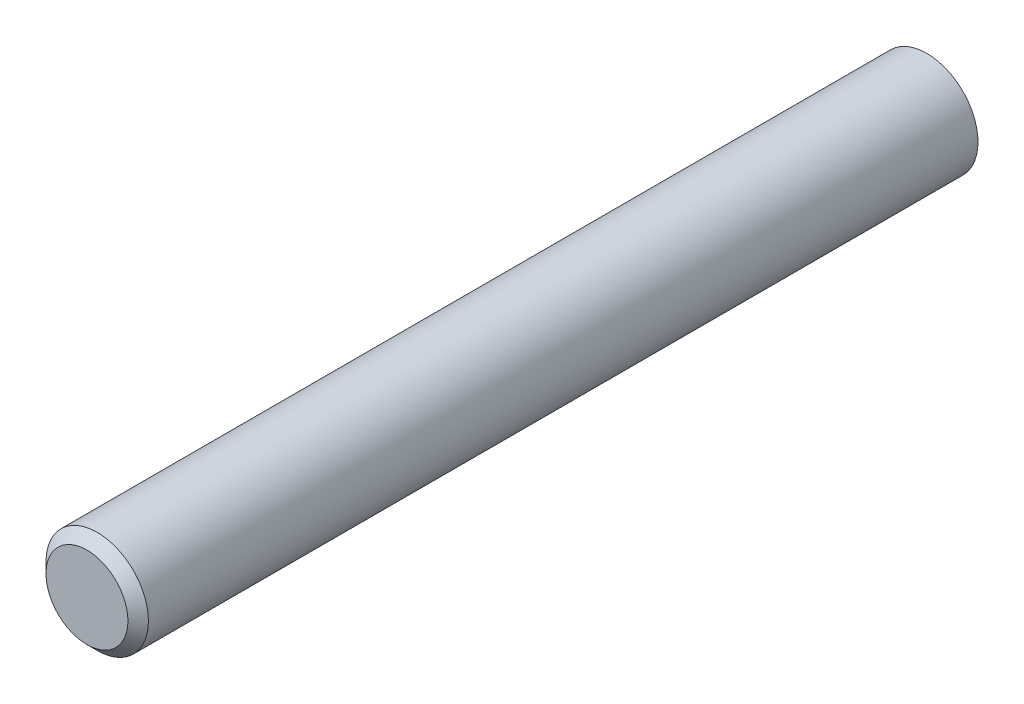
ISO-10303-21;
HEADER;
FILE_DESCRIPTION(('STEP AP214'),'2;1');
FILE_NAME('part.step','',(''),(''),'','','');
FILE_SCHEMA(('AUTOMOTIVE_DESIGN { 1 0 10303 214 1 1 1 1 }'));
ENDSEC;
DATA;
#1=APPLICATION_CONTEXT('core data for automotive mechanical design processes');
#2=APPLICATION_PROTOCOL_DEFINITION('international standard','automotive_design',2000,#1);
#3=PRODUCT_CONTEXT('',#1,'mechanical');
#4=PRODUCT('Part','Part','',(#3));
#5=PRODUCT_RELATED_PRODUCT_CATEGORY('part','',(#4));
#6=PRODUCT_DEFINITION_FORMATION('','',#4);
#7=PRODUCT_DEFINITION_CONTEXT('part definition',#1,'design');
#8=PRODUCT_DEFINITION('design','',#6,#7);
#9=PRODUCT_DEFINITION_SHAPE('','',#8);
#10=(LENGTH_UNIT() NAMED_UNIT(*) SI_UNIT(.MILLI.,.METRE.));
#11=(NAMED_UNIT(*) PLANE_ANGLE_UNIT() SI_UNIT($,.RADIAN.));
#12=(NAMED_UNIT(*) SI_UNIT($,.STERADIAN.) SOLID_ANGLE_UNIT());
#13=UNCERTAINTY_MEASURE_WITH_UNIT(LENGTH_MEASURE(1.E-05),#10,'distance_accuracy_value','');
#14=(GEOMETRIC_REPRESENTATION_CONTEXT(3) GLOBAL_UNCERTAINTY_ASSIGNED_CONTEXT((#13)) GLOBAL_UNIT_ASSIGNED_CONTEXT((#10,
#11,#12)) REPRESENTATION_CONTEXT('',''));
#15=CARTESIAN_POINT('',(0.,0.,0.));
#16=DIRECTION('',(0.,0.,1.));
#17=DIRECTION('',(1.,0.,0.));
#18=AXIS2_PLACEMENT_3D('',#15,#16,#17);
#19=CARTESIAN_POINT('',(0.,0.,82.));
#20=DIRECTION('',(0.,0.,-1.));
#21=DIRECTION('',(-1.,0.,0.));
#22=AXIS2_PLACEMENT_3D('',#19,#20,#21);
#23=CYLINDRICAL_SURFACE('',#22,5.);
#24=CARTESIAN_POINT('',(0.,0.,81.));
#25=DIRECTION('',(0.,0.,1.));
#26=DIRECTION('',(1.,0.,0.));
#27=AXIS2_PLACEMENT_3D('',#24,#25,#26);
#28=CIRCLE('',#27,5.);
#29=CARTESIAN_POINT('',(5.,0.,81.));
#30=VERTEX_POINT('',#29);
#31=EDGE_CURVE('E10',#30,#30,#28,.F.);
#32=ORIENTED_EDGE('',*,*,#31,.T.);
#33=EDGE_LOOP('',(#32));
#34=FACE_BOUND('',#33,.T.);
#35=CARTESIAN_POINT('',(0.,0.,0.));
#36=DIRECTION('',(0.,0.,1.));
#37=DIRECTION('',(1.,0.,0.));
#38=AXIS2_PLACEMENT_3D('',#35,#36,#37);
#39=CIRCLE('',#38,5.);
#40=CARTESIAN_POINT('',(5.,0.,0.));
#41=VERTEX_POINT('',#40);
#42=EDGE_CURVE('E42',#41,#41,#39,.T.);
#43=ORIENTED_EDGE('',*,*,#42,.T.);
#44=EDGE_LOOP('',(#43));
#45=FACE_BOUND('',#44,.T.);
#46=ADVANCED_FACE('F31',(#34,#45),#23,.T.);
#47=CARTESIAN_POINT('',(0.,0.,82.));
#48=DIRECTION('',(0.,0.,1.));
#49=DIRECTION('',(1.,0.,0.));
#50=AXIS2_PLACEMENT_3D('',#47,#48,#49);
#51=PLANE('',#50);
#52=CARTESIAN_POINT('',(0.,0.,82.));
#53=DIRECTION('',(0.,0.,1.));
#54=DIRECTION('',(1.,0.,0.));
#55=AXIS2_PLACEMENT_3D('',#52,#53,#54);
#56=CIRCLE('',#55,4.);
#57=CARTESIAN_POINT('',(4.,0.,82.));
#58=VERTEX_POINT('',#57);
#59=EDGE_CURVE('E38',#58,#58,#56,.T.);
#60=ORIENTED_EDGE('',*,*,#59,.T.);
#61=EDGE_LOOP('',(#60));
#62=FACE_BOUND('',#61,.T.);
#63=ADVANCED_FACE('F52',(#62),#51,.T.);
#64=CARTESIAN_POINT('',(0.,0.,0.));
#65=DIRECTION('',(0.,0.,1.));
#66=DIRECTION('',(1.,0.,0.));
#67=AXIS2_PLACEMENT_3D('',#64,#65,#66);
#68=PLANE('',#67);
#69=ORIENTED_EDGE('',*,*,#42,.F.);
#70=EDGE_LOOP('',(#69));
#71=FACE_BOUND('',#70,.T.);
#72=ADVANCED_FACE('F50',(#71),#68,.F.);
#73=CARTESIAN_POINT('',(0.,0.,82.));
#74=DIRECTION('',(0.,0.,-1.));
#75=DIRECTION('',(-1.,0.,0.));
#76=AXIS2_PLACEMENT_3D('',#73,#74,#75);
#77=CONICAL_SURFACE('',#76,4.,0.785398163397456);
#78=ORIENTED_EDGE('',*,*,#31,.F.);
#79=EDGE_LOOP('',(#78));
#80=FACE_BOUND('',#79,.T.);
#81=ORIENTED_EDGE('',*,*,#59,.F.);
#82=EDGE_LOOP('',(#81));
#83=FACE_BOUND('',#82,.T.);
#84=ADVANCED_FACE('F33',(#80,#83),#77,.T.);
#85=CLOSED_SHELL('',(#46,#63,#72,#84));
#86=MANIFOLD_SOLID_BREP('B2',#85);
#87=ADVANCED_BREP_SHAPE_REPRESENTATION('',(#18,#86),#14);
#88=SHAPE_DEFINITION_REPRESENTATION(#9,#87);
ENDSEC;
END-ISO-10303-21;
